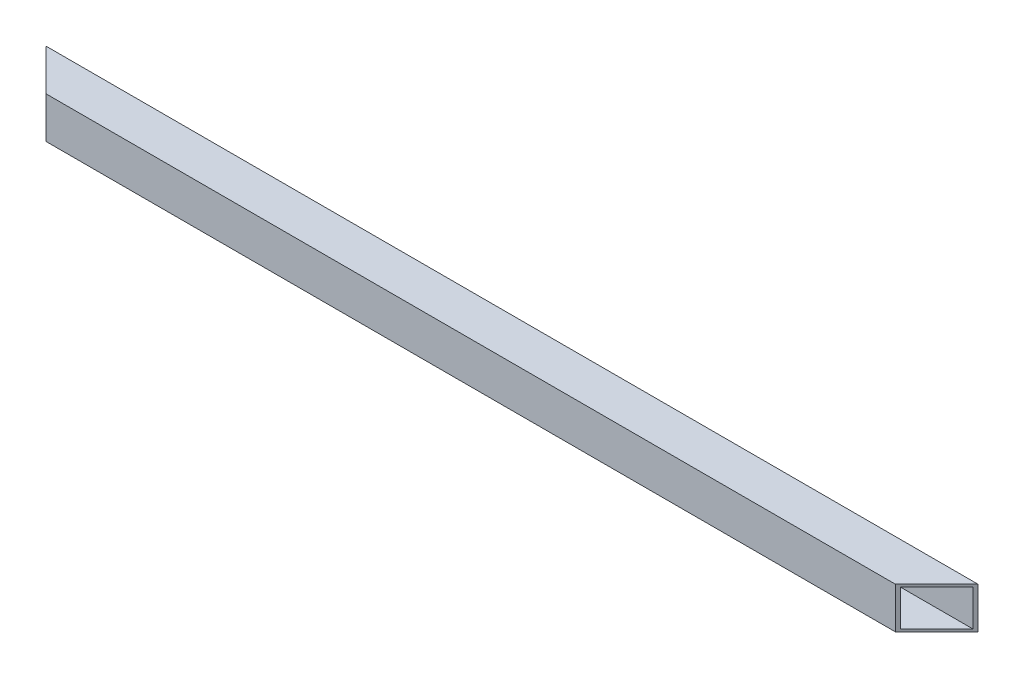
ISO-10303-21;
HEADER;
FILE_DESCRIPTION(('STEP AP214'),'2;1');
FILE_NAME('part.step','',(''),(''),'','','');
FILE_SCHEMA(('AUTOMOTIVE_DESIGN { 1 0 10303 214 1 1 1 1 }'));
ENDSEC;
DATA;
#1=APPLICATION_CONTEXT('core data for automotive mechanical design processes');
#2=APPLICATION_PROTOCOL_DEFINITION('international standard','automotive_design',2000,#1);
#3=PRODUCT_CONTEXT('',#1,'mechanical');
#4=PRODUCT('Part','Part','',(#3));
#5=PRODUCT_RELATED_PRODUCT_CATEGORY('part','',(#4));
#6=PRODUCT_DEFINITION_FORMATION('','',#4);
#7=PRODUCT_DEFINITION_CONTEXT('part definition',#1,'design');
#8=PRODUCT_DEFINITION('design','',#6,#7);
#9=PRODUCT_DEFINITION_SHAPE('','',#8);
#10=(LENGTH_UNIT() NAMED_UNIT(*) SI_UNIT(.MILLI.,.METRE.));
#11=(NAMED_UNIT(*) PLANE_ANGLE_UNIT() SI_UNIT($,.RADIAN.));
#12=(NAMED_UNIT(*) SI_UNIT($,.STERADIAN.) SOLID_ANGLE_UNIT());
#13=UNCERTAINTY_MEASURE_WITH_UNIT(LENGTH_MEASURE(1.E-05),#10,'distance_accuracy_value','');
#14=(GEOMETRIC_REPRESENTATION_CONTEXT(3) GLOBAL_UNCERTAINTY_ASSIGNED_CONTEXT((#13)) GLOBAL_UNIT_ASSIGNED_CONTEXT((#10,
#11,#12)) REPRESENTATION_CONTEXT('',''));
#15=CARTESIAN_POINT('',(0.,0.,0.));
#16=DIRECTION('',(0.,0.,1.));
#17=DIRECTION('',(1.,0.,0.));
#18=AXIS2_PLACEMENT_3D('',#15,#16,#17);
#19=CARTESIAN_POINT('',(215.,8.325,-8.325));
#20=DIRECTION('',(0.,0.,-1.));
#21=DIRECTION('',(0.,1.,0.));
#22=AXIS2_PLACEMENT_3D('',#19,#20,#21);
#23=PLANE('',#22);
#24=DIRECTION('',(-1.,0.,0.));
#25=VECTOR('',#24,1.);
#26=CARTESIAN_POINT('',(215.,8.325,-8.325));
#27=LINE('',#26,#25);
#28=CARTESIAN_POINT('',(213.8,8.325,-8.325));
#29=VERTEX_POINT('',#28);
#30=CARTESIAN_POINT('',(-213.8,8.325,-8.325));
#31=VERTEX_POINT('',#30);
#32=EDGE_CURVE('E144',#29,#31,#27,.T.);
#33=ORIENTED_EDGE('',*,*,#32,.T.);
#34=DIRECTION('',(0.,-1.,0.));
#35=VECTOR('',#34,1.);
#36=CARTESIAN_POINT('',(-213.8,8.32499999999995,-8.325));
#37=LINE('',#36,#35);
#38=CARTESIAN_POINT('',(-213.8,-8.325,-8.325));
#39=VERTEX_POINT('',#38);
#40=EDGE_CURVE('E11',#31,#39,#37,.T.);
#41=ORIENTED_EDGE('',*,*,#40,.T.);
#42=DIRECTION('',(-1.,0.,0.));
#43=VECTOR('',#42,1.);
#44=CARTESIAN_POINT('',(215.,-8.325,-8.325));
#45=LINE('',#44,#43);
#46=CARTESIAN_POINT('',(213.8,-8.325,-8.325));
#47=VERTEX_POINT('',#46);
#48=EDGE_CURVE('E146',#47,#39,#45,.T.);
#49=ORIENTED_EDGE('',*,*,#48,.F.);
#50=DIRECTION('',(0.,1.,0.));
#51=VECTOR('',#50,1.);
#52=CARTESIAN_POINT('',(213.8,8.325,-8.325));
#53=LINE('',#52,#51);
#54=EDGE_CURVE('E48',#47,#29,#53,.T.);
#55=ORIENTED_EDGE('',*,*,#54,.T.);
#56=EDGE_LOOP('',(#33,#41,#49,#55));
#57=FACE_BOUND('',#56,.T.);
#58=ADVANCED_FACE('F39',(#57),#23,.F.);
#59=CARTESIAN_POINT('',(215.,-8.325,-8.325));
#60=DIRECTION('',(0.,-1.,0.));
#61=DIRECTION('',(0.,0.,-1.));
#62=AXIS2_PLACEMENT_3D('',#59,#60,#61);
#63=PLANE('',#62);
#64=ORIENTED_EDGE('',*,*,#48,.T.);
#65=DIRECTION('',(0.707106781186548,0.,0.707106781186547));
#66=VECTOR('',#65,1.);
#67=CARTESIAN_POINT('',(0.600000000000073,-8.325,206.075));
#68=LINE('',#67,#66);
#69=CARTESIAN_POINT('',(-197.15,-8.325,8.325));
#70=VERTEX_POINT('',#69);
#71=EDGE_CURVE('E63',#39,#70,#68,.T.);
#72=ORIENTED_EDGE('',*,*,#71,.T.);
#73=DIRECTION('',(-1.,0.,0.));
#74=VECTOR('',#73,1.);
#75=CARTESIAN_POINT('',(215.,-8.325,8.325));
#76=LINE('',#75,#74);
#77=CARTESIAN_POINT('',(197.15,-8.325,8.325));
#78=VERTEX_POINT('',#77);
#79=EDGE_CURVE('E158',#78,#70,#76,.T.);
#80=ORIENTED_EDGE('',*,*,#79,.F.);
#81=DIRECTION('',(0.707106781186548,0.,-0.707106781186547));
#82=VECTOR('',#81,1.);
#83=CARTESIAN_POINT('',(214.4,-8.325,-8.92500000000003));
#84=LINE('',#83,#82);
#85=EDGE_CURVE('E115',#78,#47,#84,.T.);
#86=ORIENTED_EDGE('',*,*,#85,.T.);
#87=EDGE_LOOP('',(#64,#72,#80,#86));
#88=FACE_BOUND('',#87,.T.);
#89=ADVANCED_FACE('F209',(#88),#63,.F.);
#90=CARTESIAN_POINT('',(215.,-8.325,8.325));
#91=DIRECTION('',(0.,0.,1.));
#92=DIRECTION('',(0.,-1.,0.));
#93=AXIS2_PLACEMENT_3D('',#90,#91,#92);
#94=PLANE('',#93);
#95=ORIENTED_EDGE('',*,*,#79,.T.);
#96=DIRECTION('',(0.,1.,0.));
#97=VECTOR('',#96,1.);
#98=CARTESIAN_POINT('',(-197.15,-8.32499999999996,8.325));
#99=LINE('',#98,#97);
#100=CARTESIAN_POINT('',(-197.15,8.325,8.325));
#101=VERTEX_POINT('',#100);
#102=EDGE_CURVE('E160',#70,#101,#99,.T.);
#103=ORIENTED_EDGE('',*,*,#102,.T.);
#104=DIRECTION('',(-1.,0.,0.));
#105=VECTOR('',#104,1.);
#106=CARTESIAN_POINT('',(215.,8.325,8.325));
#107=LINE('',#106,#105);
#108=CARTESIAN_POINT('',(197.15,8.325,8.325));
#109=VERTEX_POINT('',#108);
#110=EDGE_CURVE('E169',#109,#101,#107,.T.);
#111=ORIENTED_EDGE('',*,*,#110,.F.);
#112=DIRECTION('',(0.,-1.,0.));
#113=VECTOR('',#112,1.);
#114=CARTESIAN_POINT('',(197.15,-8.325,8.325));
#115=LINE('',#114,#113);
#116=EDGE_CURVE('E191',#109,#78,#115,.T.);
#117=ORIENTED_EDGE('',*,*,#116,.T.);
#118=EDGE_LOOP('',(#95,#103,#111,#117));
#119=FACE_BOUND('',#118,.T.);
#120=ADVANCED_FACE('F207',(#119),#94,.F.);
#121=CARTESIAN_POINT('',(215.,8.325,8.325));
#122=DIRECTION('',(0.,1.,0.));
#123=DIRECTION('',(0.,0.,1.));
#124=AXIS2_PLACEMENT_3D('',#121,#122,#123);
#125=PLANE('',#124);
#126=ORIENTED_EDGE('',*,*,#110,.T.);
#127=DIRECTION('',(-0.707106781186548,0.,-0.707106781186547));
#128=VECTOR('',#127,1.);
#129=CARTESIAN_POINT('',(8.92500000000007,8.325,214.4));
#130=LINE('',#129,#128);
#131=EDGE_CURVE('E153',#101,#31,#130,.T.);
#132=ORIENTED_EDGE('',*,*,#131,.T.);
#133=ORIENTED_EDGE('',*,*,#32,.F.);
#134=DIRECTION('',(-0.707106781186548,0.,0.707106781186547));
#135=VECTOR('',#134,1.);
#136=CARTESIAN_POINT('',(206.075,8.325,-0.600000000000029));
#137=LINE('',#136,#135);
#138=EDGE_CURVE('E55',#29,#109,#137,.T.);
#139=ORIENTED_EDGE('',*,*,#138,.T.);
#140=EDGE_LOOP('',(#126,#132,#133,#139));
#141=FACE_BOUND('',#140,.T.);
#142=ADVANCED_FACE('F151',(#141),#125,.F.);
#143=CARTESIAN_POINT('',(195.95,-9.525,9.52499999999995));
#144=DIRECTION('',(-0.707106781186547,0.,-0.707106781186548));
#145=DIRECTION('',(-0.707106781186548,0.,0.707106781186547));
#146=AXIS2_PLACEMENT_3D('',#143,#144,#145);
#147=PLANE('',#146);
#148=DIRECTION('',(0.,1.,0.));
#149=VECTOR('',#148,1.);
#150=CARTESIAN_POINT('',(195.95,-9.525,9.52499999999995));
#151=LINE('',#150,#149);
#152=CARTESIAN_POINT('',(195.95,-9.525,9.52499999999995));
#153=VERTEX_POINT('',#152);
#154=CARTESIAN_POINT('',(195.95,9.525,9.52499999999995));
#155=VERTEX_POINT('',#154);
#156=EDGE_CURVE('E126',#153,#155,#151,.T.);
#157=ORIENTED_EDGE('',*,*,#156,.F.);
#158=DIRECTION('',(-0.707106781186548,0.,0.707106781186547));
#159=VECTOR('',#158,1.);
#160=CARTESIAN_POINT('',(195.95,-9.525,9.52499999999995));
#161=LINE('',#160,#159);
#162=CARTESIAN_POINT('',(215.,-9.525,-9.525));
#163=VERTEX_POINT('',#162);
#164=EDGE_CURVE('E178',#163,#153,#161,.T.);
#165=ORIENTED_EDGE('',*,*,#164,.F.);
#166=DIRECTION('',(0.,1.,0.));
#167=VECTOR('',#166,1.);
#168=CARTESIAN_POINT('',(215.,-9.525,-9.525));
#169=LINE('',#168,#167);
#170=CARTESIAN_POINT('',(215.,9.525,-9.52500000000005));
#171=VERTEX_POINT('',#170);
#172=EDGE_CURVE('E164',#163,#171,#169,.T.);
#173=ORIENTED_EDGE('',*,*,#172,.T.);
#174=DIRECTION('',(-0.707106781186548,0.,0.707106781186547));
#175=VECTOR('',#174,1.);
#176=CARTESIAN_POINT('',(195.95,9.525,9.52499999999995));
#177=LINE('',#176,#175);
#178=EDGE_CURVE('E182',#171,#155,#177,.T.);
#179=ORIENTED_EDGE('',*,*,#178,.T.);
#180=EDGE_LOOP('',(#157,#165,#173,#179));
#181=FACE_BOUND('',#180,.T.);
#182=ORIENTED_EDGE('',*,*,#54,.F.);
#183=ORIENTED_EDGE('',*,*,#85,.F.);
#184=ORIENTED_EDGE('',*,*,#116,.F.);
#185=ORIENTED_EDGE('',*,*,#138,.F.);
#186=EDGE_LOOP('',(#182,#183,#184,#185));
#187=FACE_BOUND('',#186,.T.);
#188=ADVANCED_FACE('F210',(#181,#187),#147,.F.);
#189=CARTESIAN_POINT('',(-195.95,-9.525,9.525));
#190=DIRECTION('',(0.707106781186547,0.,-0.707106781186548));
#191=DIRECTION('',(-0.707106781186548,0.,-0.707106781186547));
#192=AXIS2_PLACEMENT_3D('',#189,#190,#191);
#193=PLANE('',#192);
#194=DIRECTION('',(0.,1.,0.));
#195=VECTOR('',#194,1.);
#196=CARTESIAN_POINT('',(-215.,-9.525,-9.525));
#197=LINE('',#196,#195);
#198=CARTESIAN_POINT('',(-215.,-9.525,-9.525));
#199=VERTEX_POINT('',#198);
#200=CARTESIAN_POINT('',(-215.,9.525,-9.525));
#201=VERTEX_POINT('',#200);
#202=EDGE_CURVE('E167',#199,#201,#197,.T.);
#203=ORIENTED_EDGE('',*,*,#202,.F.);
#204=DIRECTION('',(-0.707106781186548,0.,-0.707106781186547));
#205=VECTOR('',#204,1.);
#206=CARTESIAN_POINT('',(-195.95,-9.525,9.525));
#207=LINE('',#206,#205);
#208=CARTESIAN_POINT('',(-195.95,-9.525,9.525));
#209=VERTEX_POINT('',#208);
#210=EDGE_CURVE('E109',#209,#199,#207,.T.);
#211=ORIENTED_EDGE('',*,*,#210,.F.);
#212=DIRECTION('',(0.,1.,0.));
#213=VECTOR('',#212,1.);
#214=CARTESIAN_POINT('',(-195.95,-9.525,9.525));
#215=LINE('',#214,#213);
#216=CARTESIAN_POINT('',(-195.95,9.525,9.525));
#217=VERTEX_POINT('',#216);
#218=EDGE_CURVE('E103',#209,#217,#215,.T.);
#219=ORIENTED_EDGE('',*,*,#218,.T.);
#220=DIRECTION('',(-0.707106781186548,0.,-0.707106781186547));
#221=VECTOR('',#220,1.);
#222=CARTESIAN_POINT('',(-195.95,9.525,9.525));
#223=LINE('',#222,#221);
#224=EDGE_CURVE('E106',#217,#201,#223,.T.);
#225=ORIENTED_EDGE('',*,*,#224,.T.);
#226=EDGE_LOOP('',(#203,#211,#219,#225));
#227=FACE_BOUND('',#226,.T.);
#228=ORIENTED_EDGE('',*,*,#102,.F.);
#229=ORIENTED_EDGE('',*,*,#71,.F.);
#230=ORIENTED_EDGE('',*,*,#40,.F.);
#231=ORIENTED_EDGE('',*,*,#131,.F.);
#232=EDGE_LOOP('',(#228,#229,#230,#231));
#233=FACE_BOUND('',#232,.T.);
#234=ADVANCED_FACE('F105',(#227,#233),#193,.F.);
#235=CARTESIAN_POINT('',(215.,-9.525,-9.525));
#236=DIRECTION('',(0.,0.,1.));
#237=DIRECTION('',(0.,-1.,0.));
#238=AXIS2_PLACEMENT_3D('',#235,#236,#237);
#239=PLANE('',#238);
#240=ORIENTED_EDGE('',*,*,#202,.T.);
#241=DIRECTION('',(-1.,0.,0.));
#242=VECTOR('',#241,1.);
#243=CARTESIAN_POINT('',(215.,9.525,-9.525));
#244=LINE('',#243,#242);
#245=EDGE_CURVE('E123',#171,#201,#244,.T.);
#246=ORIENTED_EDGE('',*,*,#245,.F.);
#247=ORIENTED_EDGE('',*,*,#172,.F.);
#248=DIRECTION('',(-1.,0.,0.));
#249=VECTOR('',#248,1.);
#250=CARTESIAN_POINT('',(215.,-9.525,-9.525));
#251=LINE('',#250,#249);
#252=EDGE_CURVE('E136',#163,#199,#251,.T.);
#253=ORIENTED_EDGE('',*,*,#252,.T.);
#254=EDGE_LOOP('',(#240,#246,#247,#253));
#255=FACE_BOUND('',#254,.T.);
#256=ADVANCED_FACE('F41',(#255),#239,.F.);
#257=CARTESIAN_POINT('',(215.,9.525,9.525));
#258=DIRECTION('',(0.,-1.,0.));
#259=DIRECTION('',(0.,0.,-1.));
#260=AXIS2_PLACEMENT_3D('',#257,#258,#259);
#261=PLANE('',#260);
#262=ORIENTED_EDGE('',*,*,#245,.T.);
#263=ORIENTED_EDGE('',*,*,#224,.F.);
#264=DIRECTION('',(-1.,0.,0.));
#265=VECTOR('',#264,1.);
#266=CARTESIAN_POINT('',(215.,9.525,9.525));
#267=LINE('',#266,#265);
#268=EDGE_CURVE('E121',#155,#217,#267,.T.);
#269=ORIENTED_EDGE('',*,*,#268,.F.);
#270=ORIENTED_EDGE('',*,*,#178,.F.);
#271=EDGE_LOOP('',(#262,#263,#269,#270));
#272=FACE_BOUND('',#271,.T.);
#273=ADVANCED_FACE('F119',(#272),#261,.F.);
#274=CARTESIAN_POINT('',(215.,-9.525,9.525));
#275=DIRECTION('',(0.,0.,-1.));
#276=DIRECTION('',(0.,1.,0.));
#277=AXIS2_PLACEMENT_3D('',#274,#275,#276);
#278=PLANE('',#277);
#279=ORIENTED_EDGE('',*,*,#268,.T.);
#280=ORIENTED_EDGE('',*,*,#218,.F.);
#281=DIRECTION('',(-1.,0.,0.));
#282=VECTOR('',#281,1.);
#283=CARTESIAN_POINT('',(215.,-9.525,9.525));
#284=LINE('',#283,#282);
#285=EDGE_CURVE('E131',#153,#209,#284,.T.);
#286=ORIENTED_EDGE('',*,*,#285,.F.);
#287=ORIENTED_EDGE('',*,*,#156,.T.);
#288=EDGE_LOOP('',(#279,#280,#286,#287));
#289=FACE_BOUND('',#288,.T.);
#290=ADVANCED_FACE('F129',(#289),#278,.F.);
#291=CARTESIAN_POINT('',(215.,-9.525,9.525));
#292=DIRECTION('',(0.,1.,0.));
#293=DIRECTION('',(0.,0.,1.));
#294=AXIS2_PLACEMENT_3D('',#291,#292,#293);
#295=PLANE('',#294);
#296=ORIENTED_EDGE('',*,*,#285,.T.);
#297=ORIENTED_EDGE('',*,*,#210,.T.);
#298=ORIENTED_EDGE('',*,*,#252,.F.);
#299=ORIENTED_EDGE('',*,*,#164,.T.);
#300=EDGE_LOOP('',(#296,#297,#298,#299));
#301=FACE_BOUND('',#300,.T.);
#302=ADVANCED_FACE('F177',(#301),#295,.F.);
#303=CLOSED_SHELL('',(#58,#89,#120,#142,#188,#234,#256,#273,#290,#302));
#304=MANIFOLD_SOLID_BREP('B2',#303);
#305=ADVANCED_BREP_SHAPE_REPRESENTATION('',(#18,#304),#14);
#306=SHAPE_DEFINITION_REPRESENTATION(#9,#305);
ENDSEC;
END-ISO-10303-21;
